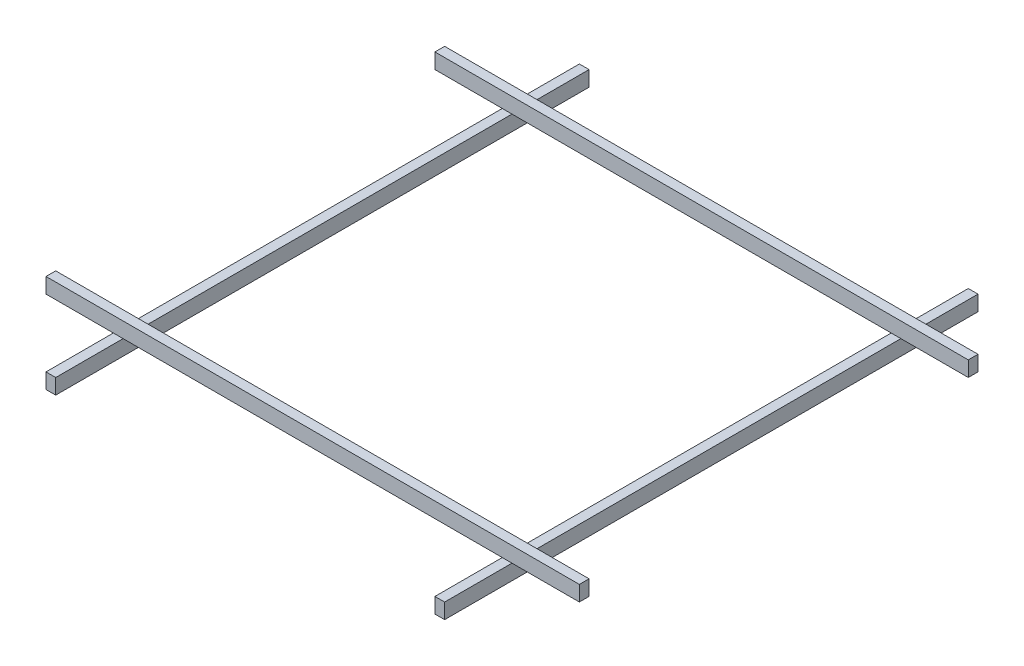
ISO-10303-21;
HEADER;
FILE_DESCRIPTION(('STEP AP214'),'2;1');
FILE_NAME('part.step','',(''),(''),'','','');
FILE_SCHEMA(('AUTOMOTIVE_DESIGN { 1 0 10303 214 1 1 1 1 }'));
ENDSEC;
DATA;
#1=APPLICATION_CONTEXT('core data for automotive mechanical design processes');
#2=APPLICATION_PROTOCOL_DEFINITION('international standard','automotive_design',2000,#1);
#3=PRODUCT_CONTEXT('',#1,'mechanical');
#4=PRODUCT('Part','Part','',(#3));
#5=PRODUCT_RELATED_PRODUCT_CATEGORY('part','',(#4));
#6=PRODUCT_DEFINITION_FORMATION('','',#4);
#7=PRODUCT_DEFINITION_CONTEXT('part definition',#1,'design');
#8=PRODUCT_DEFINITION('design','',#6,#7);
#9=PRODUCT_DEFINITION_SHAPE('','',#8);
#10=(LENGTH_UNIT() NAMED_UNIT(*) SI_UNIT(.MILLI.,.METRE.));
#11=(NAMED_UNIT(*) PLANE_ANGLE_UNIT() SI_UNIT($,.RADIAN.));
#12=(NAMED_UNIT(*) SI_UNIT($,.STERADIAN.) SOLID_ANGLE_UNIT());
#13=UNCERTAINTY_MEASURE_WITH_UNIT(LENGTH_MEASURE(1.E-05),#10,'distance_accuracy_value','');
#14=(GEOMETRIC_REPRESENTATION_CONTEXT(3) GLOBAL_UNCERTAINTY_ASSIGNED_CONTEXT((#13)) GLOBAL_UNIT_ASSIGNED_CONTEXT((#10,
#11,#12)) REPRESENTATION_CONTEXT('',''));
#15=CARTESIAN_POINT('',(0.,0.,0.));
#16=DIRECTION('',(0.,0.,1.));
#17=DIRECTION('',(1.,0.,0.));
#18=AXIS2_PLACEMENT_3D('',#15,#16,#17);
#19=CARTESIAN_POINT('',(4572.,209.55,-704.849999999999));
#20=DIRECTION('',(0.,0.,1.));
#21=DIRECTION('',(1.,0.,0.));
#22=AXIS2_PLACEMENT_3D('',#19,#20,#21);
#23=PLANE('',#22);
#24=DIRECTION('',(0.,1.,0.));
#25=VECTOR('',#24,1.);
#26=CARTESIAN_POINT('',(-304.8,209.55,-704.849999999999));
#27=LINE('',#26,#25);
#28=CARTESIAN_POINT('',(-304.8,69.85,-704.849999999999));
#29=VERTEX_POINT('',#28);
#30=CARTESIAN_POINT('',(-304.8,209.55,-704.849999999999));
#31=VERTEX_POINT('',#30);
#32=EDGE_CURVE('E126',#29,#31,#27,.T.);
#33=ORIENTED_EDGE('',*,*,#32,.T.);
#34=DIRECTION('',(-1.,0.,0.));
#35=VECTOR('',#34,1.);
#36=CARTESIAN_POINT('',(4572.,209.55,-704.849999999999));
#37=LINE('',#36,#35);
#38=CARTESIAN_POINT('',(4572.,209.55,-704.849999999999));
#39=VERTEX_POINT('',#38);
#40=EDGE_CURVE('E13',#39,#31,#37,.T.);
#41=ORIENTED_EDGE('',*,*,#40,.F.);
#42=DIRECTION('',(0.,1.,0.));
#43=VECTOR('',#42,1.);
#44=CARTESIAN_POINT('',(4572.,209.55,-704.849999999999));
#45=LINE('',#44,#43);
#46=CARTESIAN_POINT('',(4572.,69.85,-704.849999999999));
#47=VERTEX_POINT('',#46);
#48=EDGE_CURVE('E114',#47,#39,#45,.T.);
#49=ORIENTED_EDGE('',*,*,#48,.F.);
#50=DIRECTION('',(-1.,0.,0.));
#51=VECTOR('',#50,1.);
#52=CARTESIAN_POINT('',(4572.,69.85,-704.849999999999));
#53=LINE('',#52,#51);
#54=EDGE_CURVE('E122',#47,#29,#53,.T.);
#55=ORIENTED_EDGE('',*,*,#54,.T.);
#56=EDGE_LOOP('',(#33,#41,#49,#55));
#57=FACE_BOUND('',#56,.T.);
#58=ADVANCED_FACE('F63',(#57),#23,.F.);
#59=CARTESIAN_POINT('',(4572.,209.55,-615.949999999999));
#60=DIRECTION('',(0.,-1.,0.));
#61=DIRECTION('',(0.,0.,-1.));
#62=AXIS2_PLACEMENT_3D('',#59,#60,#61);
#63=PLANE('',#62);
#64=DIRECTION('',(0.,0.,1.));
#65=VECTOR('',#64,1.);
#66=CARTESIAN_POINT('',(-304.8,209.55,-615.949999999999));
#67=LINE('',#66,#65);
#68=CARTESIAN_POINT('',(-304.8,209.55,-615.949999999999));
#69=VERTEX_POINT('',#68);
#70=EDGE_CURVE('E118',#31,#69,#67,.T.);
#71=ORIENTED_EDGE('',*,*,#70,.T.);
#72=DIRECTION('',(-1.,0.,0.));
#73=VECTOR('',#72,1.);
#74=CARTESIAN_POINT('',(4572.,209.55,-615.949999999999));
#75=LINE('',#74,#73);
#76=CARTESIAN_POINT('',(4572.,209.55,-615.949999999999));
#77=VERTEX_POINT('',#76);
#78=EDGE_CURVE('E71',#77,#69,#75,.T.);
#79=ORIENTED_EDGE('',*,*,#78,.F.);
#80=DIRECTION('',(0.,0.,1.));
#81=VECTOR('',#80,1.);
#82=CARTESIAN_POINT('',(4572.,209.55,-615.949999999999));
#83=LINE('',#82,#81);
#84=EDGE_CURVE('E109',#39,#77,#83,.T.);
#85=ORIENTED_EDGE('',*,*,#84,.F.);
#86=ORIENTED_EDGE('',*,*,#40,.T.);
#87=EDGE_LOOP('',(#71,#79,#85,#86));
#88=FACE_BOUND('',#87,.T.);
#89=ADVANCED_FACE('F117',(#88),#63,.F.);
#90=CARTESIAN_POINT('',(4572.,209.55,-615.949999999999));
#91=DIRECTION('',(0.,0.,-1.));
#92=DIRECTION('',(-1.,0.,0.));
#93=AXIS2_PLACEMENT_3D('',#90,#91,#92);
#94=PLANE('',#93);
#95=DIRECTION('',(0.,-1.,0.));
#96=VECTOR('',#95,1.);
#97=CARTESIAN_POINT('',(-304.8,209.55,-615.949999999999));
#98=LINE('',#97,#96);
#99=CARTESIAN_POINT('',(-304.8,69.85,-615.949999999999));
#100=VERTEX_POINT('',#99);
#101=EDGE_CURVE('E96',#69,#100,#98,.T.);
#102=ORIENTED_EDGE('',*,*,#101,.T.);
#103=DIRECTION('',(-1.,0.,0.));
#104=VECTOR('',#103,1.);
#105=CARTESIAN_POINT('',(4572.,69.85,-615.949999999999));
#106=LINE('',#105,#104);
#107=CARTESIAN_POINT('',(4572.,69.85,-615.949999999999));
#108=VERTEX_POINT('',#107);
#109=EDGE_CURVE('E119',#108,#100,#106,.T.);
#110=ORIENTED_EDGE('',*,*,#109,.F.);
#111=DIRECTION('',(0.,-1.,0.));
#112=VECTOR('',#111,1.);
#113=CARTESIAN_POINT('',(4572.,209.55,-615.949999999999));
#114=LINE('',#113,#112);
#115=EDGE_CURVE('E112',#77,#108,#114,.T.);
#116=ORIENTED_EDGE('',*,*,#115,.F.);
#117=ORIENTED_EDGE('',*,*,#78,.T.);
#118=EDGE_LOOP('',(#102,#110,#116,#117));
#119=FACE_BOUND('',#118,.T.);
#120=ADVANCED_FACE('F120',(#119),#94,.F.);
#121=CARTESIAN_POINT('',(4572.,69.85,-615.949999999999));
#122=DIRECTION('',(0.,1.,0.));
#123=DIRECTION('',(0.,0.,1.));
#124=AXIS2_PLACEMENT_3D('',#121,#122,#123);
#125=PLANE('',#124);
#126=DIRECTION('',(0.,0.,-1.));
#127=VECTOR('',#126,1.);
#128=CARTESIAN_POINT('',(-304.8,69.85,-615.949999999999));
#129=LINE('',#128,#127);
#130=EDGE_CURVE('E102',#100,#29,#129,.T.);
#131=ORIENTED_EDGE('',*,*,#130,.T.);
#132=ORIENTED_EDGE('',*,*,#54,.F.);
#133=DIRECTION('',(0.,0.,-1.));
#134=VECTOR('',#133,1.);
#135=CARTESIAN_POINT('',(4572.,69.85,-615.949999999999));
#136=LINE('',#135,#134);
#137=EDGE_CURVE('E79',#108,#47,#136,.T.);
#138=ORIENTED_EDGE('',*,*,#137,.F.);
#139=ORIENTED_EDGE('',*,*,#109,.T.);
#140=EDGE_LOOP('',(#131,#132,#138,#139));
#141=FACE_BOUND('',#140,.T.);
#142=ADVANCED_FACE('F133',(#141),#125,.F.);
#143=CARTESIAN_POINT('',(4572.,139.7,-1016.));
#144=DIRECTION('',(1.,0.,0.));
#145=DIRECTION('',(0.,0.,-1.));
#146=AXIS2_PLACEMENT_3D('',#143,#144,#145);
#147=PLANE('',#146);
#148=ORIENTED_EDGE('',*,*,#48,.T.);
#149=ORIENTED_EDGE('',*,*,#84,.T.);
#150=ORIENTED_EDGE('',*,*,#115,.T.);
#151=ORIENTED_EDGE('',*,*,#137,.T.);
#152=EDGE_LOOP('',(#148,#149,#150,#151));
#153=FACE_BOUND('',#152,.T.);
#154=ADVANCED_FACE('F110',(#153),#147,.T.);
#155=CARTESIAN_POINT('',(-304.8,139.7,-1016.));
#156=DIRECTION('',(1.,0.,0.));
#157=DIRECTION('',(0.,0.,-1.));
#158=AXIS2_PLACEMENT_3D('',#155,#156,#157);
#159=PLANE('',#158);
#160=ORIENTED_EDGE('',*,*,#32,.F.);
#161=ORIENTED_EDGE('',*,*,#130,.F.);
#162=ORIENTED_EDGE('',*,*,#101,.F.);
#163=ORIENTED_EDGE('',*,*,#70,.F.);
#164=EDGE_LOOP('',(#160,#161,#162,#163));
#165=FACE_BOUND('',#164,.T.);
#166=ADVANCED_FACE('F136',(#165),#159,.F.);
#167=CLOSED_SHELL('',(#58,#89,#120,#142,#154,#166));
#168=MANIFOLD_SOLID_BREP('B2',#167);
#169=CARTESIAN_POINT('',(4572.,209.55,-4260.85));
#170=DIRECTION('',(0.,0.,1.));
#171=DIRECTION('',(1.,0.,0.));
#172=AXIS2_PLACEMENT_3D('',#169,#170,#171);
#173=PLANE('',#172);
#174=DIRECTION('',(0.,1.,0.));
#175=VECTOR('',#174,1.);
#176=CARTESIAN_POINT('',(-304.8,209.55,-4260.85));
#177=LINE('',#176,#175);
#178=CARTESIAN_POINT('',(-304.8,69.85,-4260.85));
#179=VERTEX_POINT('',#178);
#180=CARTESIAN_POINT('',(-304.8,209.55,-4260.85));
#181=VERTEX_POINT('',#180);
#182=EDGE_CURVE('E283',#179,#181,#177,.T.);
#183=ORIENTED_EDGE('',*,*,#182,.T.);
#184=DIRECTION('',(-1.,0.,0.));
#185=VECTOR('',#184,1.);
#186=CARTESIAN_POINT('',(4572.,209.55,-4260.85));
#187=LINE('',#186,#185);
#188=CARTESIAN_POINT('',(4572.,209.55,-4260.85));
#189=VERTEX_POINT('',#188);
#190=EDGE_CURVE('E61',#189,#181,#187,.T.);
#191=ORIENTED_EDGE('',*,*,#190,.F.);
#192=DIRECTION('',(0.,1.,0.));
#193=VECTOR('',#192,1.);
#194=CARTESIAN_POINT('',(4572.,209.55,-4260.85));
#195=LINE('',#194,#193);
#196=CARTESIAN_POINT('',(4572.,69.85,-4260.85));
#197=VERTEX_POINT('',#196);
#198=EDGE_CURVE('E271',#197,#189,#195,.T.);
#199=ORIENTED_EDGE('',*,*,#198,.F.);
#200=DIRECTION('',(-1.,0.,0.));
#201=VECTOR('',#200,1.);
#202=CARTESIAN_POINT('',(4572.,69.85,-4260.85));
#203=LINE('',#202,#201);
#204=EDGE_CURVE('E279',#197,#179,#203,.T.);
#205=ORIENTED_EDGE('',*,*,#204,.T.);
#206=EDGE_LOOP('',(#183,#191,#199,#205));
#207=FACE_BOUND('',#206,.T.);
#208=ADVANCED_FACE('F220',(#207),#173,.F.);
#209=CARTESIAN_POINT('',(4572.,209.55,-4171.95));
#210=DIRECTION('',(0.,-1.,0.));
#211=DIRECTION('',(0.,0.,-1.));
#212=AXIS2_PLACEMENT_3D('',#209,#210,#211);
#213=PLANE('',#212);
#214=DIRECTION('',(0.,0.,1.));
#215=VECTOR('',#214,1.);
#216=CARTESIAN_POINT('',(-304.8,209.55,-4171.95));
#217=LINE('',#216,#215);
#218=CARTESIAN_POINT('',(-304.8,209.55,-4171.95));
#219=VERTEX_POINT('',#218);
#220=EDGE_CURVE('E275',#181,#219,#217,.T.);
#221=ORIENTED_EDGE('',*,*,#220,.T.);
#222=DIRECTION('',(-1.,0.,0.));
#223=VECTOR('',#222,1.);
#224=CARTESIAN_POINT('',(4572.,209.55,-4171.95));
#225=LINE('',#224,#223);
#226=CARTESIAN_POINT('',(4572.,209.55,-4171.95));
#227=VERTEX_POINT('',#226);
#228=EDGE_CURVE('E228',#227,#219,#225,.T.);
#229=ORIENTED_EDGE('',*,*,#228,.F.);
#230=DIRECTION('',(0.,0.,1.));
#231=VECTOR('',#230,1.);
#232=CARTESIAN_POINT('',(4572.,209.55,-4171.95));
#233=LINE('',#232,#231);
#234=EDGE_CURVE('E266',#189,#227,#233,.T.);
#235=ORIENTED_EDGE('',*,*,#234,.F.);
#236=ORIENTED_EDGE('',*,*,#190,.T.);
#237=EDGE_LOOP('',(#221,#229,#235,#236));
#238=FACE_BOUND('',#237,.T.);
#239=ADVANCED_FACE('F274',(#238),#213,.F.);
#240=CARTESIAN_POINT('',(4572.,209.55,-4171.95));
#241=DIRECTION('',(0.,0.,-1.));
#242=DIRECTION('',(-1.,0.,0.));
#243=AXIS2_PLACEMENT_3D('',#240,#241,#242);
#244=PLANE('',#243);
#245=DIRECTION('',(0.,-1.,0.));
#246=VECTOR('',#245,1.);
#247=CARTESIAN_POINT('',(-304.8,209.55,-4171.95));
#248=LINE('',#247,#246);
#249=CARTESIAN_POINT('',(-304.8,69.85,-4171.95));
#250=VERTEX_POINT('',#249);
#251=EDGE_CURVE('E253',#219,#250,#248,.T.);
#252=ORIENTED_EDGE('',*,*,#251,.T.);
#253=DIRECTION('',(-1.,0.,0.));
#254=VECTOR('',#253,1.);
#255=CARTESIAN_POINT('',(4572.,69.85,-4171.95));
#256=LINE('',#255,#254);
#257=CARTESIAN_POINT('',(4572.,69.85,-4171.95));
#258=VERTEX_POINT('',#257);
#259=EDGE_CURVE('E276',#258,#250,#256,.T.);
#260=ORIENTED_EDGE('',*,*,#259,.F.);
#261=DIRECTION('',(0.,-1.,0.));
#262=VECTOR('',#261,1.);
#263=CARTESIAN_POINT('',(4572.,209.55,-4171.95));
#264=LINE('',#263,#262);
#265=EDGE_CURVE('E269',#227,#258,#264,.T.);
#266=ORIENTED_EDGE('',*,*,#265,.F.);
#267=ORIENTED_EDGE('',*,*,#228,.T.);
#268=EDGE_LOOP('',(#252,#260,#266,#267));
#269=FACE_BOUND('',#268,.T.);
#270=ADVANCED_FACE('F277',(#269),#244,.F.);
#271=CARTESIAN_POINT('',(4572.,69.85,-4171.95));
#272=DIRECTION('',(0.,1.,0.));
#273=DIRECTION('',(0.,0.,1.));
#274=AXIS2_PLACEMENT_3D('',#271,#272,#273);
#275=PLANE('',#274);
#276=DIRECTION('',(0.,0.,-1.));
#277=VECTOR('',#276,1.);
#278=CARTESIAN_POINT('',(-304.8,69.85,-4171.95));
#279=LINE('',#278,#277);
#280=EDGE_CURVE('E259',#250,#179,#279,.T.);
#281=ORIENTED_EDGE('',*,*,#280,.T.);
#282=ORIENTED_EDGE('',*,*,#204,.F.);
#283=DIRECTION('',(0.,0.,-1.));
#284=VECTOR('',#283,1.);
#285=CARTESIAN_POINT('',(4572.,69.85,-4171.95));
#286=LINE('',#285,#284);
#287=EDGE_CURVE('E236',#258,#197,#286,.T.);
#288=ORIENTED_EDGE('',*,*,#287,.F.);
#289=ORIENTED_EDGE('',*,*,#259,.T.);
#290=EDGE_LOOP('',(#281,#282,#288,#289));
#291=FACE_BOUND('',#290,.T.);
#292=ADVANCED_FACE('F290',(#291),#275,.F.);
#293=CARTESIAN_POINT('',(4572.,139.7,-4572.));
#294=DIRECTION('',(1.,0.,0.));
#295=DIRECTION('',(0.,0.,-1.));
#296=AXIS2_PLACEMENT_3D('',#293,#294,#295);
#297=PLANE('',#296);
#298=ORIENTED_EDGE('',*,*,#198,.T.);
#299=ORIENTED_EDGE('',*,*,#234,.T.);
#300=ORIENTED_EDGE('',*,*,#265,.T.);
#301=ORIENTED_EDGE('',*,*,#287,.T.);
#302=EDGE_LOOP('',(#298,#299,#300,#301));
#303=FACE_BOUND('',#302,.T.);
#304=ADVANCED_FACE('F267',(#303),#297,.T.);
#305=CARTESIAN_POINT('',(-304.8,139.7,-4572.));
#306=DIRECTION('',(1.,0.,0.));
#307=DIRECTION('',(0.,0.,-1.));
#308=AXIS2_PLACEMENT_3D('',#305,#306,#307);
#309=PLANE('',#308);
#310=ORIENTED_EDGE('',*,*,#182,.F.);
#311=ORIENTED_EDGE('',*,*,#280,.F.);
#312=ORIENTED_EDGE('',*,*,#251,.F.);
#313=ORIENTED_EDGE('',*,*,#220,.F.);
#314=EDGE_LOOP('',(#310,#311,#312,#313));
#315=FACE_BOUND('',#314,.T.);
#316=ADVANCED_FACE('F293',(#315),#309,.F.);
#317=CLOSED_SHELL('',(#208,#239,#270,#292,#304,#316));
#318=MANIFOLD_SOLID_BREP('B7',#317);
#319=CARTESIAN_POINT('',(3867.15,69.85,-4876.8));
#320=DIRECTION('',(1.,0.,0.));
#321=DIRECTION('',(0.,0.,-1.));
#322=AXIS2_PLACEMENT_3D('',#319,#320,#321);
#323=PLANE('',#322);
#324=DIRECTION('',(0.,1.,0.));
#325=VECTOR('',#324,1.);
#326=CARTESIAN_POINT('',(3867.15,69.85,0.));
#327=LINE('',#326,#325);
#328=CARTESIAN_POINT('',(3867.15,-69.85,0.));
#329=VERTEX_POINT('',#328);
#330=CARTESIAN_POINT('',(3867.15,69.85,0.));
#331=VERTEX_POINT('',#330);
#332=EDGE_CURVE('E439',#329,#331,#327,.T.);
#333=ORIENTED_EDGE('',*,*,#332,.T.);
#334=DIRECTION('',(0.,0.,1.));
#335=VECTOR('',#334,1.);
#336=CARTESIAN_POINT('',(3867.15,69.85,-4876.8));
#337=LINE('',#336,#335);
#338=CARTESIAN_POINT('',(3867.15,69.85,-4876.8));
#339=VERTEX_POINT('',#338);
#340=EDGE_CURVE('E218',#339,#331,#337,.T.);
#341=ORIENTED_EDGE('',*,*,#340,.F.);
#342=DIRECTION('',(0.,1.,0.));
#343=VECTOR('',#342,1.);
#344=CARTESIAN_POINT('',(3867.15,69.85,-4876.8));
#345=LINE('',#344,#343);
#346=CARTESIAN_POINT('',(3867.15,-69.85,-4876.8));
#347=VERTEX_POINT('',#346);
#348=EDGE_CURVE('E427',#347,#339,#345,.T.);
#349=ORIENTED_EDGE('',*,*,#348,.F.);
#350=DIRECTION('',(0.,0.,1.));
#351=VECTOR('',#350,1.);
#352=CARTESIAN_POINT('',(3867.15,-69.85,-4876.8));
#353=LINE('',#352,#351);
#354=EDGE_CURVE('E435',#347,#329,#353,.T.);
#355=ORIENTED_EDGE('',*,*,#354,.T.);
#356=EDGE_LOOP('',(#333,#341,#349,#355));
#357=FACE_BOUND('',#356,.T.);
#358=ADVANCED_FACE('F376',(#357),#323,.F.);
#359=CARTESIAN_POINT('',(3956.05,69.85,-4876.8));
#360=DIRECTION('',(0.,-1.,0.));
#361=DIRECTION('',(0.,0.,-1.));
#362=AXIS2_PLACEMENT_3D('',#359,#360,#361);
#363=PLANE('',#362);
#364=DIRECTION('',(1.,0.,0.));
#365=VECTOR('',#364,1.);
#366=CARTESIAN_POINT('',(3956.05,69.85,0.));
#367=LINE('',#366,#365);
#368=CARTESIAN_POINT('',(3956.05,69.85,0.));
#369=VERTEX_POINT('',#368);
#370=EDGE_CURVE('E431',#331,#369,#367,.T.);
#371=ORIENTED_EDGE('',*,*,#370,.T.);
#372=DIRECTION('',(0.,0.,1.));
#373=VECTOR('',#372,1.);
#374=CARTESIAN_POINT('',(3956.05,69.85,-4876.8));
#375=LINE('',#374,#373);
#376=CARTESIAN_POINT('',(3956.05,69.85,-4876.8));
#377=VERTEX_POINT('',#376);
#378=EDGE_CURVE('E384',#377,#369,#375,.T.);
#379=ORIENTED_EDGE('',*,*,#378,.F.);
#380=DIRECTION('',(1.,0.,0.));
#381=VECTOR('',#380,1.);
#382=CARTESIAN_POINT('',(3956.05,69.85,-4876.8));
#383=LINE('',#382,#381);
#384=EDGE_CURVE('E422',#339,#377,#383,.T.);
#385=ORIENTED_EDGE('',*,*,#384,.F.);
#386=ORIENTED_EDGE('',*,*,#340,.T.);
#387=EDGE_LOOP('',(#371,#379,#385,#386));
#388=FACE_BOUND('',#387,.T.);
#389=ADVANCED_FACE('F430',(#388),#363,.F.);
#390=CARTESIAN_POINT('',(3956.05,69.85,-4876.8));
#391=DIRECTION('',(-1.,0.,0.));
#392=DIRECTION('',(0.,0.,1.));
#393=AXIS2_PLACEMENT_3D('',#390,#391,#392);
#394=PLANE('',#393);
#395=DIRECTION('',(0.,-1.,0.));
#396=VECTOR('',#395,1.);
#397=CARTESIAN_POINT('',(3956.05,69.85,0.));
#398=LINE('',#397,#396);
#399=CARTESIAN_POINT('',(3956.05,-69.85,0.));
#400=VERTEX_POINT('',#399);
#401=EDGE_CURVE('E409',#369,#400,#398,.T.);
#402=ORIENTED_EDGE('',*,*,#401,.T.);
#403=DIRECTION('',(0.,0.,1.));
#404=VECTOR('',#403,1.);
#405=CARTESIAN_POINT('',(3956.05,-69.85,-4876.8));
#406=LINE('',#405,#404);
#407=CARTESIAN_POINT('',(3956.05,-69.85,-4876.8));
#408=VERTEX_POINT('',#407);
#409=EDGE_CURVE('E432',#408,#400,#406,.T.);
#410=ORIENTED_EDGE('',*,*,#409,.F.);
#411=DIRECTION('',(0.,-1.,0.));
#412=VECTOR('',#411,1.);
#413=CARTESIAN_POINT('',(3956.05,69.85,-4876.8));
#414=LINE('',#413,#412);
#415=EDGE_CURVE('E425',#377,#408,#414,.T.);
#416=ORIENTED_EDGE('',*,*,#415,.F.);
#417=ORIENTED_EDGE('',*,*,#378,.T.);
#418=EDGE_LOOP('',(#402,#410,#416,#417));
#419=FACE_BOUND('',#418,.T.);
#420=ADVANCED_FACE('F433',(#419),#394,.F.);
#421=CARTESIAN_POINT('',(3956.05,-69.85,-4876.8));
#422=DIRECTION('',(0.,1.,0.));
#423=DIRECTION('',(0.,0.,1.));
#424=AXIS2_PLACEMENT_3D('',#421,#422,#423);
#425=PLANE('',#424);
#426=DIRECTION('',(-1.,0.,0.));
#427=VECTOR('',#426,1.);
#428=CARTESIAN_POINT('',(3956.05,-69.85,0.));
#429=LINE('',#428,#427);
#430=EDGE_CURVE('E415',#400,#329,#429,.T.);
#431=ORIENTED_EDGE('',*,*,#430,.T.);
#432=ORIENTED_EDGE('',*,*,#354,.F.);
#433=DIRECTION('',(-1.,0.,0.));
#434=VECTOR('',#433,1.);
#435=CARTESIAN_POINT('',(3956.05,-69.85,-4876.8));
#436=LINE('',#435,#434);
#437=EDGE_CURVE('E392',#408,#347,#436,.T.);
#438=ORIENTED_EDGE('',*,*,#437,.F.);
#439=ORIENTED_EDGE('',*,*,#409,.T.);
#440=EDGE_LOOP('',(#431,#432,#438,#439));
#441=FACE_BOUND('',#440,.T.);
#442=ADVANCED_FACE('F446',(#441),#425,.F.);
#443=CARTESIAN_POINT('',(3556.,0.,-4876.8));
#444=DIRECTION('',(0.,0.,-1.));
#445=DIRECTION('',(-1.,0.,0.));
#446=AXIS2_PLACEMENT_3D('',#443,#444,#445);
#447=PLANE('',#446);
#448=ORIENTED_EDGE('',*,*,#348,.T.);
#449=ORIENTED_EDGE('',*,*,#384,.T.);
#450=ORIENTED_EDGE('',*,*,#415,.T.);
#451=ORIENTED_EDGE('',*,*,#437,.T.);
#452=EDGE_LOOP('',(#448,#449,#450,#451));
#453=FACE_BOUND('',#452,.T.);
#454=ADVANCED_FACE('F423',(#453),#447,.T.);
#455=CARTESIAN_POINT('',(3556.,0.,0.));
#456=DIRECTION('',(0.,0.,-1.));
#457=DIRECTION('',(-1.,0.,0.));
#458=AXIS2_PLACEMENT_3D('',#455,#456,#457);
#459=PLANE('',#458);
#460=ORIENTED_EDGE('',*,*,#332,.F.);
#461=ORIENTED_EDGE('',*,*,#430,.F.);
#462=ORIENTED_EDGE('',*,*,#401,.F.);
#463=ORIENTED_EDGE('',*,*,#370,.F.);
#464=EDGE_LOOP('',(#460,#461,#462,#463));
#465=FACE_BOUND('',#464,.T.);
#466=ADVANCED_FACE('F449',(#465),#459,.F.);
#467=CLOSED_SHELL('',(#358,#389,#420,#442,#454,#466));
#468=MANIFOLD_SOLID_BREP('B55',#467);
#469=CARTESIAN_POINT('',(311.15,69.85,-4876.8));
#470=DIRECTION('',(1.,0.,0.));
#471=DIRECTION('',(0.,0.,-1.));
#472=AXIS2_PLACEMENT_3D('',#469,#470,#471);
#473=PLANE('',#472);
#474=DIRECTION('',(0.,1.,0.));
#475=VECTOR('',#474,1.);
#476=CARTESIAN_POINT('',(311.15,69.85,8.88178419700125E-13));
#477=LINE('',#476,#475);
#478=CARTESIAN_POINT('',(311.15,-69.85,8.88178419700125E-13));
#479=VERTEX_POINT('',#478);
#480=CARTESIAN_POINT('',(311.15,69.85,8.88178419700125E-13));
#481=VERTEX_POINT('',#480);
#482=EDGE_CURVE('E586',#479,#481,#477,.T.);
#483=ORIENTED_EDGE('',*,*,#482,.T.);
#484=DIRECTION('',(0.,0.,1.));
#485=VECTOR('',#484,1.);
#486=CARTESIAN_POINT('',(311.15,69.85,-4876.8));
#487=LINE('',#486,#485);
#488=CARTESIAN_POINT('',(311.15,69.85,-4876.8));
#489=VERTEX_POINT('',#488);
#490=EDGE_CURVE('E374',#489,#481,#487,.T.);
#491=ORIENTED_EDGE('',*,*,#490,.F.);
#492=DIRECTION('',(0.,1.,0.));
#493=VECTOR('',#492,1.);
#494=CARTESIAN_POINT('',(311.15,69.85,-4876.8));
#495=LINE('',#494,#493);
#496=CARTESIAN_POINT('',(311.15,-69.85,-4876.8));
#497=VERTEX_POINT('',#496);
#498=EDGE_CURVE('E574',#497,#489,#495,.T.);
#499=ORIENTED_EDGE('',*,*,#498,.F.);
#500=DIRECTION('',(0.,0.,1.));
#501=VECTOR('',#500,1.);
#502=CARTESIAN_POINT('',(311.15,-69.85,-4876.8));
#503=LINE('',#502,#501);
#504=EDGE_CURVE('E582',#497,#479,#503,.T.);
#505=ORIENTED_EDGE('',*,*,#504,.T.);
#506=EDGE_LOOP('',(#483,#491,#499,#505));
#507=FACE_BOUND('',#506,.T.);
#508=ADVANCED_FACE('F523',(#507),#473,.F.);
#509=CARTESIAN_POINT('',(400.05,69.85,-4876.8));
#510=DIRECTION('',(0.,-1.,0.));
#511=DIRECTION('',(0.,0.,-1.));
#512=AXIS2_PLACEMENT_3D('',#509,#510,#511);
#513=PLANE('',#512);
#514=DIRECTION('',(1.,0.,0.));
#515=VECTOR('',#514,1.);
#516=CARTESIAN_POINT('',(400.05,69.85,8.88178419700125E-13));
#517=LINE('',#516,#515);
#518=CARTESIAN_POINT('',(400.05,69.85,8.88178419700125E-13));
#519=VERTEX_POINT('',#518);
#520=EDGE_CURVE('E578',#481,#519,#517,.T.);
#521=ORIENTED_EDGE('',*,*,#520,.T.);
#522=DIRECTION('',(0.,0.,1.));
#523=VECTOR('',#522,1.);
#524=CARTESIAN_POINT('',(400.05,69.85,-4876.8));
#525=LINE('',#524,#523);
#526=CARTESIAN_POINT('',(400.05,69.85,-4876.8));
#527=VERTEX_POINT('',#526);
#528=EDGE_CURVE('E531',#527,#519,#525,.T.);
#529=ORIENTED_EDGE('',*,*,#528,.F.);
#530=DIRECTION('',(1.,0.,0.));
#531=VECTOR('',#530,1.);
#532=CARTESIAN_POINT('',(400.05,69.85,-4876.8));
#533=LINE('',#532,#531);
#534=EDGE_CURVE('E569',#489,#527,#533,.T.);
#535=ORIENTED_EDGE('',*,*,#534,.F.);
#536=ORIENTED_EDGE('',*,*,#490,.T.);
#537=EDGE_LOOP('',(#521,#529,#535,#536));
#538=FACE_BOUND('',#537,.T.);
#539=ADVANCED_FACE('F577',(#538),#513,.F.);
#540=CARTESIAN_POINT('',(400.05,69.85,-4876.8));
#541=DIRECTION('',(-1.,0.,0.));
#542=DIRECTION('',(0.,0.,1.));
#543=AXIS2_PLACEMENT_3D('',#540,#541,#542);
#544=PLANE('',#543);
#545=DIRECTION('',(0.,-1.,0.));
#546=VECTOR('',#545,1.);
#547=CARTESIAN_POINT('',(400.05,69.85,8.88178419700125E-13));
#548=LINE('',#547,#546);
#549=CARTESIAN_POINT('',(400.05,-69.85,8.88178419700125E-13));
#550=VERTEX_POINT('',#549);
#551=EDGE_CURVE('E556',#519,#550,#548,.T.);
#552=ORIENTED_EDGE('',*,*,#551,.T.);
#553=DIRECTION('',(0.,0.,1.));
#554=VECTOR('',#553,1.);
#555=CARTESIAN_POINT('',(400.05,-69.85,-4876.8));
#556=LINE('',#555,#554);
#557=CARTESIAN_POINT('',(400.05,-69.85,-4876.8));
#558=VERTEX_POINT('',#557);
#559=EDGE_CURVE('E579',#558,#550,#556,.T.);
#560=ORIENTED_EDGE('',*,*,#559,.F.);
#561=DIRECTION('',(0.,-1.,0.));
#562=VECTOR('',#561,1.);
#563=CARTESIAN_POINT('',(400.05,69.85,-4876.8));
#564=LINE('',#563,#562);
#565=EDGE_CURVE('E572',#527,#558,#564,.T.);
#566=ORIENTED_EDGE('',*,*,#565,.F.);
#567=ORIENTED_EDGE('',*,*,#528,.T.);
#568=EDGE_LOOP('',(#552,#560,#566,#567));
#569=FACE_BOUND('',#568,.T.);
#570=ADVANCED_FACE('F580',(#569),#544,.F.);
#571=CARTESIAN_POINT('',(400.05,-69.85,-4876.8));
#572=DIRECTION('',(0.,1.,0.));
#573=DIRECTION('',(0.,0.,1.));
#574=AXIS2_PLACEMENT_3D('',#571,#572,#573);
#575=PLANE('',#574);
#576=DIRECTION('',(-1.,0.,0.));
#577=VECTOR('',#576,1.);
#578=CARTESIAN_POINT('',(400.05,-69.85,8.88178419700125E-13));
#579=LINE('',#578,#577);
#580=EDGE_CURVE('E562',#550,#479,#579,.T.);
#581=ORIENTED_EDGE('',*,*,#580,.T.);
#582=ORIENTED_EDGE('',*,*,#504,.F.);
#583=DIRECTION('',(-1.,0.,0.));
#584=VECTOR('',#583,1.);
#585=CARTESIAN_POINT('',(400.05,-69.85,-4876.8));
#586=LINE('',#585,#584);
#587=EDGE_CURVE('E539',#558,#497,#586,.T.);
#588=ORIENTED_EDGE('',*,*,#587,.F.);
#589=ORIENTED_EDGE('',*,*,#559,.T.);
#590=EDGE_LOOP('',(#581,#582,#588,#589));
#591=FACE_BOUND('',#590,.T.);
#592=ADVANCED_FACE('F593',(#591),#575,.F.);
#593=CARTESIAN_POINT('',(0.,0.,-4876.8));
#594=DIRECTION('',(0.,0.,-1.));
#595=DIRECTION('',(-1.,0.,0.));
#596=AXIS2_PLACEMENT_3D('',#593,#594,#595);
#597=PLANE('',#596);
#598=ORIENTED_EDGE('',*,*,#498,.T.);
#599=ORIENTED_EDGE('',*,*,#534,.T.);
#600=ORIENTED_EDGE('',*,*,#565,.T.);
#601=ORIENTED_EDGE('',*,*,#587,.T.);
#602=EDGE_LOOP('',(#598,#599,#600,#601));
#603=FACE_BOUND('',#602,.T.);
#604=ADVANCED_FACE('F570',(#603),#597,.T.);
#605=CARTESIAN_POINT('',(0.,0.,8.88178419700125E-13));
#606=DIRECTION('',(0.,0.,-1.));
#607=DIRECTION('',(-1.,0.,0.));
#608=AXIS2_PLACEMENT_3D('',#605,#606,#607);
#609=PLANE('',#608);
#610=ORIENTED_EDGE('',*,*,#482,.F.);
#611=ORIENTED_EDGE('',*,*,#580,.F.);
#612=ORIENTED_EDGE('',*,*,#551,.F.);
#613=ORIENTED_EDGE('',*,*,#520,.F.);
#614=EDGE_LOOP('',(#610,#611,#612,#613));
#615=FACE_BOUND('',#614,.T.);
#616=ADVANCED_FACE('F596',(#615),#609,.F.);
#617=CLOSED_SHELL('',(#508,#539,#570,#592,#604,#616));
#618=MANIFOLD_SOLID_BREP('B212',#617);
#619=ADVANCED_BREP_SHAPE_REPRESENTATION('',(#18,#168,#318,#468,#618),#14);
#620=SHAPE_DEFINITION_REPRESENTATION(#9,#619);
ENDSEC;
END-ISO-10303-21;
